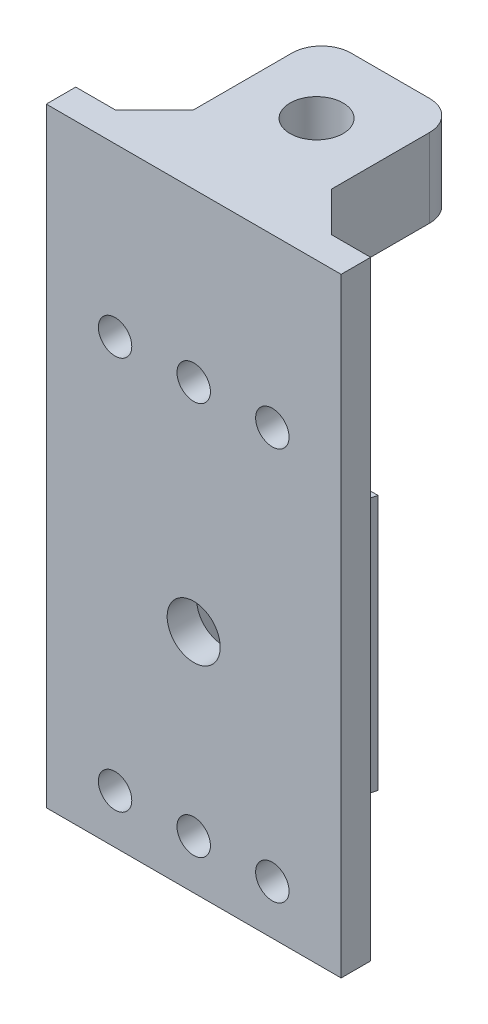
ISO-10303-21;
HEADER;
FILE_DESCRIPTION(('STEP AP214'),'2;1');
FILE_NAME('part.step','',(''),(''),'','','');
FILE_SCHEMA(('AUTOMOTIVE_DESIGN { 1 0 10303 214 1 1 1 1 }'));
ENDSEC;
DATA;
#1=APPLICATION_CONTEXT('core data for automotive mechanical design processes');
#2=APPLICATION_PROTOCOL_DEFINITION('international standard','automotive_design',2000,#1);
#3=PRODUCT_CONTEXT('',#1,'mechanical');
#4=PRODUCT('Part','Part','',(#3));
#5=PRODUCT_RELATED_PRODUCT_CATEGORY('part','',(#4));
#6=PRODUCT_DEFINITION_FORMATION('','',#4);
#7=PRODUCT_DEFINITION_CONTEXT('part definition',#1,'design');
#8=PRODUCT_DEFINITION('design','',#6,#7);
#9=PRODUCT_DEFINITION_SHAPE('','',#8);
#10=(LENGTH_UNIT() NAMED_UNIT(*) SI_UNIT(.MILLI.,.METRE.));
#11=(NAMED_UNIT(*) PLANE_ANGLE_UNIT() SI_UNIT($,.RADIAN.));
#12=(NAMED_UNIT(*) SI_UNIT($,.STERADIAN.) SOLID_ANGLE_UNIT());
#13=UNCERTAINTY_MEASURE_WITH_UNIT(LENGTH_MEASURE(1.E-05),#10,'distance_accuracy_value','');
#14=(GEOMETRIC_REPRESENTATION_CONTEXT(3) GLOBAL_UNCERTAINTY_ASSIGNED_CONTEXT((#13)) GLOBAL_UNIT_ASSIGNED_CONTEXT((#10,
#11,#12)) REPRESENTATION_CONTEXT('',''));
#15=CARTESIAN_POINT('',(0.,0.,0.));
#16=DIRECTION('',(0.,0.,1.));
#17=DIRECTION('',(1.,0.,0.));
#18=AXIS2_PLACEMENT_3D('',#15,#16,#17);
#19=CARTESIAN_POINT('',(0.,0.,0.));
#20=DIRECTION('',(0.,0.,1.));
#21=DIRECTION('',(1.,0.,0.));
#22=AXIS2_PLACEMENT_3D('',#19,#20,#21);
#23=PLANE('',#22);
#24=DIRECTION('',(0.,1.,0.));
#25=VECTOR('',#24,1.);
#26=CARTESIAN_POINT('',(4.55,-11.,0.));
#27=LINE('',#26,#25);
#28=CARTESIAN_POINT('',(4.55000000000003,-11.,0.));
#29=VERTEX_POINT('',#28);
#30=CARTESIAN_POINT('',(4.55000000000003,15.,0.));
#31=VERTEX_POINT('',#30);
#32=EDGE_CURVE('E261',#29,#31,#27,.T.);
#33=ORIENTED_EDGE('',*,*,#32,.F.);
#34=DIRECTION('',(-1.,0.,0.));
#35=VECTOR('',#34,1.);
#36=CARTESIAN_POINT('',(11.45,-11.,0.));
#37=LINE('',#36,#35);
#38=CARTESIAN_POINT('',(11.45,-11.,0.));
#39=VERTEX_POINT('',#38);
#40=EDGE_CURVE('E271',#39,#29,#37,.T.);
#41=ORIENTED_EDGE('',*,*,#40,.F.);
#42=DIRECTION('',(0.,-1.,0.));
#43=VECTOR('',#42,1.);
#44=CARTESIAN_POINT('',(11.45,-11.,0.));
#45=LINE('',#44,#43);
#46=CARTESIAN_POINT('',(11.45,15.,0.));
#47=VERTEX_POINT('',#46);
#48=EDGE_CURVE('E278',#47,#39,#45,.T.);
#49=ORIENTED_EDGE('',*,*,#48,.F.);
#50=DIRECTION('',(1.,0.,0.));
#51=VECTOR('',#50,1.);
#52=CARTESIAN_POINT('',(11.45,15.,0.));
#53=LINE('',#52,#51);
#54=EDGE_CURVE('E275',#31,#47,#53,.T.);
#55=ORIENTED_EDGE('',*,*,#54,.F.);
#56=EDGE_LOOP('',(#33,#41,#49,#55));
#57=FACE_BOUND('',#56,.T.);
#58=CARTESIAN_POINT('',(8.,-18.,0.));
#59=DIRECTION('',(0.,0.,1.));
#60=DIRECTION('',(1.,0.,0.));
#61=AXIS2_PLACEMENT_3D('',#58,#59,#60);
#62=CIRCLE('',#61,1.7);
#63=CARTESIAN_POINT('',(9.7,-18.,0.));
#64=VERTEX_POINT('',#63);
#65=EDGE_CURVE('E354',#64,#64,#62,.F.);
#66=ORIENTED_EDGE('',*,*,#65,.F.);
#67=EDGE_LOOP('',(#66));
#68=FACE_BOUND('',#67,.T.);
#69=CARTESIAN_POINT('',(-8.,22.,0.));
#70=DIRECTION('',(0.,0.,1.));
#71=DIRECTION('',(1.,0.,0.));
#72=AXIS2_PLACEMENT_3D('',#69,#70,#71);
#73=CIRCLE('',#72,1.7);
#74=CARTESIAN_POINT('',(-6.3,22.,0.));
#75=VERTEX_POINT('',#74);
#76=EDGE_CURVE('E493',#75,#75,#73,.F.);
#77=ORIENTED_EDGE('',*,*,#76,.F.);
#78=EDGE_LOOP('',(#77));
#79=FACE_BOUND('',#78,.T.);
#80=CARTESIAN_POINT('',(8.,22.,0.));
#81=DIRECTION('',(0.,0.,1.));
#82=DIRECTION('',(1.,0.,0.));
#83=AXIS2_PLACEMENT_3D('',#80,#81,#82);
#84=CIRCLE('',#83,1.7);
#85=CARTESIAN_POINT('',(9.7,22.,0.));
#86=VERTEX_POINT('',#85);
#87=EDGE_CURVE('E495',#86,#86,#84,.T.);
#88=ORIENTED_EDGE('',*,*,#87,.T.);
#89=EDGE_LOOP('',(#88));
#90=FACE_BOUND('',#89,.T.);
#91=CARTESIAN_POINT('',(0.,22.,0.));
#92=DIRECTION('',(0.,0.,1.));
#93=DIRECTION('',(1.,0.,0.));
#94=AXIS2_PLACEMENT_3D('',#91,#92,#93);
#95=CIRCLE('',#94,1.7);
#96=CARTESIAN_POINT('',(1.7,22.,0.));
#97=VERTEX_POINT('',#96);
#98=EDGE_CURVE('E406',#97,#97,#95,.T.);
#99=ORIENTED_EDGE('',*,*,#98,.T.);
#100=EDGE_LOOP('',(#99));
#101=FACE_BOUND('',#100,.T.);
#102=CARTESIAN_POINT('',(0.,0.,0.));
#103=DIRECTION('',(0.,0.,1.));
#104=DIRECTION('',(1.,0.,0.));
#105=AXIS2_PLACEMENT_3D('',#102,#103,#104);
#106=CIRCLE('',#105,2.7);
#107=CARTESIAN_POINT('',(2.7,0.,0.));
#108=VERTEX_POINT('',#107);
#109=EDGE_CURVE('E391',#108,#108,#106,.T.);
#110=ORIENTED_EDGE('',*,*,#109,.T.);
#111=EDGE_LOOP('',(#110));
#112=FACE_BOUND('',#111,.T.);
#113=CARTESIAN_POINT('',(-8.,-18.,0.));
#114=DIRECTION('',(0.,0.,1.));
#115=DIRECTION('',(1.,0.,0.));
#116=AXIS2_PLACEMENT_3D('',#113,#114,#115);
#117=CIRCLE('',#116,1.7);
#118=CARTESIAN_POINT('',(-6.3,-18.,0.));
#119=VERTEX_POINT('',#118);
#120=EDGE_CURVE('E387',#119,#119,#117,.T.);
#121=ORIENTED_EDGE('',*,*,#120,.T.);
#122=EDGE_LOOP('',(#121));
#123=FACE_BOUND('',#122,.T.);
#124=CARTESIAN_POINT('',(0.,-18.,0.));
#125=DIRECTION('',(0.,0.,1.));
#126=DIRECTION('',(1.,0.,0.));
#127=AXIS2_PLACEMENT_3D('',#124,#125,#126);
#128=CIRCLE('',#127,1.7);
#129=CARTESIAN_POINT('',(1.7,-18.,0.));
#130=VERTEX_POINT('',#129);
#131=EDGE_CURVE('E384',#130,#130,#128,.F.);
#132=ORIENTED_EDGE('',*,*,#131,.F.);
#133=EDGE_LOOP('',(#132));
#134=FACE_BOUND('',#133,.T.);
#135=DIRECTION('',(-1.,0.,0.));
#136=VECTOR('',#135,1.);
#137=CARTESIAN_POINT('',(6.99999999999999,31.,0.));
#138=LINE('',#137,#136);
#139=CARTESIAN_POINT('',(11.,31.,0.));
#140=VERTEX_POINT('',#139);
#141=CARTESIAN_POINT('',(-11.,31.,0.));
#142=VERTEX_POINT('',#141);
#143=EDGE_CURVE('E326',#140,#142,#138,.T.);
#144=ORIENTED_EDGE('',*,*,#143,.F.);
#145=DIRECTION('',(0.,1.,0.));
#146=VECTOR('',#145,1.);
#147=CARTESIAN_POINT('',(11.,39.,0.));
#148=LINE('',#147,#146);
#149=CARTESIAN_POINT('',(11.,39.,0.));
#150=VERTEX_POINT('',#149);
#151=EDGE_CURVE('E448',#140,#150,#148,.T.);
#152=ORIENTED_EDGE('',*,*,#151,.T.);
#153=DIRECTION('',(1.,0.,0.));
#154=VECTOR('',#153,1.);
#155=CARTESIAN_POINT('',(0.,39.,0.));
#156=LINE('',#155,#154);
#157=CARTESIAN_POINT('',(15.,39.,0.));
#158=VERTEX_POINT('',#157);
#159=EDGE_CURVE('E403',#150,#158,#156,.T.);
#160=ORIENTED_EDGE('',*,*,#159,.T.);
#161=DIRECTION('',(0.,1.,0.));
#162=VECTOR('',#161,1.);
#163=CARTESIAN_POINT('',(15.,0.,0.));
#164=LINE('',#163,#162);
#165=CARTESIAN_POINT('',(15.,-23.,0.));
#166=VERTEX_POINT('',#165);
#167=EDGE_CURVE('E400',#166,#158,#164,.T.);
#168=ORIENTED_EDGE('',*,*,#167,.F.);
#169=DIRECTION('',(1.,0.,0.));
#170=VECTOR('',#169,1.);
#171=CARTESIAN_POINT('',(0.,-23.,0.));
#172=LINE('',#171,#170);
#173=CARTESIAN_POINT('',(-15.,-23.,0.));
#174=VERTEX_POINT('',#173);
#175=EDGE_CURVE('E397',#174,#166,#172,.T.);
#176=ORIENTED_EDGE('',*,*,#175,.F.);
#177=DIRECTION('',(0.,1.,0.));
#178=VECTOR('',#177,1.);
#179=CARTESIAN_POINT('',(-15.,0.,0.));
#180=LINE('',#179,#178);
#181=CARTESIAN_POINT('',(-15.,39.,0.));
#182=VERTEX_POINT('',#181);
#183=EDGE_CURVE('E394',#174,#182,#180,.T.);
#184=ORIENTED_EDGE('',*,*,#183,.T.);
#185=CARTESIAN_POINT('',(-11.,39.,0.));
#186=VERTEX_POINT('',#185);
#187=EDGE_CURVE('E413',#182,#186,#156,.T.);
#188=ORIENTED_EDGE('',*,*,#187,.T.);
#189=DIRECTION('',(0.,-1.,0.));
#190=VECTOR('',#189,1.);
#191=CARTESIAN_POINT('',(-11.,31.,0.));
#192=LINE('',#191,#190);
#193=EDGE_CURVE('E443',#186,#142,#192,.T.);
#194=ORIENTED_EDGE('',*,*,#193,.T.);
#195=EDGE_LOOP('',(#144,#152,#160,#168,#176,#184,#188,#194));
#196=FACE_BOUND('',#195,.T.);
#197=DIRECTION('',(0.,1.,0.));
#198=VECTOR('',#197,1.);
#199=CARTESIAN_POINT('',(-11.45,-11.,0.));
#200=LINE('',#199,#198);
#201=CARTESIAN_POINT('',(-11.45,-11.,0.));
#202=VERTEX_POINT('',#201);
#203=CARTESIAN_POINT('',(-11.45,15.,0.));
#204=VERTEX_POINT('',#203);
#205=EDGE_CURVE('E254',#202,#204,#200,.T.);
#206=ORIENTED_EDGE('',*,*,#205,.F.);
#207=DIRECTION('',(-1.,0.,0.));
#208=VECTOR('',#207,1.);
#209=CARTESIAN_POINT('',(-11.45,-11.,0.));
#210=LINE('',#209,#208);
#211=CARTESIAN_POINT('',(-4.55000000000003,-11.,0.));
#212=VERTEX_POINT('',#211);
#213=EDGE_CURVE('E219',#212,#202,#210,.T.);
#214=ORIENTED_EDGE('',*,*,#213,.F.);
#215=DIRECTION('',(0.,-1.,0.));
#216=VECTOR('',#215,1.);
#217=CARTESIAN_POINT('',(-4.55,-11.,0.));
#218=LINE('',#217,#216);
#219=CARTESIAN_POINT('',(-4.55000000000003,15.,0.));
#220=VERTEX_POINT('',#219);
#221=EDGE_CURVE('E264',#220,#212,#218,.T.);
#222=ORIENTED_EDGE('',*,*,#221,.F.);
#223=DIRECTION('',(1.,0.,0.));
#224=VECTOR('',#223,1.);
#225=CARTESIAN_POINT('',(-11.45,15.,0.));
#226=LINE('',#225,#224);
#227=EDGE_CURVE('E232',#204,#220,#226,.T.);
#228=ORIENTED_EDGE('',*,*,#227,.F.);
#229=EDGE_LOOP('',(#206,#214,#222,#228));
#230=FACE_BOUND('',#229,.T.);
#231=ADVANCED_FACE('F36',(#57,#68,#79,#90,#101,#112,#123,#134,#196,#230),#23,.F.);
#232=CARTESIAN_POINT('',(-15.,0.,3.));
#233=DIRECTION('',(-1.,0.,0.));
#234=DIRECTION('',(0.,0.,1.));
#235=AXIS2_PLACEMENT_3D('',#232,#233,#234);
#236=PLANE('',#235);
#237=ORIENTED_EDGE('',*,*,#183,.F.);
#238=DIRECTION('',(0.,0.,-1.));
#239=VECTOR('',#238,1.);
#240=CARTESIAN_POINT('',(-15.,-23.,3.));
#241=LINE('',#240,#239);
#242=CARTESIAN_POINT('',(-15.,-23.,3.));
#243=VERTEX_POINT('',#242);
#244=EDGE_CURVE('E417',#243,#174,#241,.T.);
#245=ORIENTED_EDGE('',*,*,#244,.F.);
#246=DIRECTION('',(0.,1.,0.));
#247=VECTOR('',#246,1.);
#248=CARTESIAN_POINT('',(-15.,0.,3.));
#249=LINE('',#248,#247);
#250=CARTESIAN_POINT('',(-15.,39.,3.));
#251=VERTEX_POINT('',#250);
#252=EDGE_CURVE('E360',#243,#251,#249,.T.);
#253=ORIENTED_EDGE('',*,*,#252,.T.);
#254=DIRECTION('',(0.,0.,-1.));
#255=VECTOR('',#254,1.);
#256=CARTESIAN_POINT('',(-15.,39.,3.));
#257=LINE('',#256,#255);
#258=EDGE_CURVE('E383',#251,#182,#257,.T.);
#259=ORIENTED_EDGE('',*,*,#258,.T.);
#260=EDGE_LOOP('',(#237,#245,#253,#259));
#261=FACE_BOUND('',#260,.T.);
#262=ADVANCED_FACE('F520',(#261),#236,.T.);
#263=CARTESIAN_POINT('',(0.,-23.,3.));
#264=DIRECTION('',(0.,1.,0.));
#265=DIRECTION('',(0.,0.,1.));
#266=AXIS2_PLACEMENT_3D('',#263,#264,#265);
#267=PLANE('',#266);
#268=ORIENTED_EDGE('',*,*,#175,.T.);
#269=DIRECTION('',(0.,0.,-1.));
#270=VECTOR('',#269,1.);
#271=CARTESIAN_POINT('',(15.,-23.,3.));
#272=LINE('',#271,#270);
#273=CARTESIAN_POINT('',(15.,-23.,3.));
#274=VERTEX_POINT('',#273);
#275=EDGE_CURVE('E480',#274,#166,#272,.T.);
#276=ORIENTED_EDGE('',*,*,#275,.F.);
#277=DIRECTION('',(1.,0.,0.));
#278=VECTOR('',#277,1.);
#279=CARTESIAN_POINT('',(0.,-23.,3.));
#280=LINE('',#279,#278);
#281=EDGE_CURVE('E363',#243,#274,#280,.T.);
#282=ORIENTED_EDGE('',*,*,#281,.F.);
#283=ORIENTED_EDGE('',*,*,#244,.T.);
#284=EDGE_LOOP('',(#268,#276,#282,#283));
#285=FACE_BOUND('',#284,.T.);
#286=ADVANCED_FACE('F526',(#285),#267,.F.);
#287=CARTESIAN_POINT('',(15.,0.,3.));
#288=DIRECTION('',(-1.,0.,0.));
#289=DIRECTION('',(0.,-1.,0.));
#290=AXIS2_PLACEMENT_3D('',#287,#288,#289);
#291=PLANE('',#290);
#292=ORIENTED_EDGE('',*,*,#167,.T.);
#293=DIRECTION('',(0.,0.,-1.));
#294=VECTOR('',#293,1.);
#295=CARTESIAN_POINT('',(15.,39.,3.));
#296=LINE('',#295,#294);
#297=CARTESIAN_POINT('',(15.,39.,3.));
#298=VERTEX_POINT('',#297);
#299=EDGE_CURVE('E484',#298,#158,#296,.T.);
#300=ORIENTED_EDGE('',*,*,#299,.F.);
#301=DIRECTION('',(0.,1.,0.));
#302=VECTOR('',#301,1.);
#303=CARTESIAN_POINT('',(15.,0.,3.));
#304=LINE('',#303,#302);
#305=EDGE_CURVE('E366',#274,#298,#304,.T.);
#306=ORIENTED_EDGE('',*,*,#305,.F.);
#307=ORIENTED_EDGE('',*,*,#275,.T.);
#308=EDGE_LOOP('',(#292,#300,#306,#307));
#309=FACE_BOUND('',#308,.T.);
#310=ADVANCED_FACE('F541',(#309),#291,.F.);
#311=CARTESIAN_POINT('',(-8.,22.,3.));
#312=DIRECTION('',(0.,0.,-1.));
#313=DIRECTION('',(-1.,0.,0.));
#314=AXIS2_PLACEMENT_3D('',#311,#312,#313);
#315=CYLINDRICAL_SURFACE('',#314,1.7);
#316=CARTESIAN_POINT('',(-8.,22.,3.));
#317=DIRECTION('',(0.,0.,1.));
#318=DIRECTION('',(1.,0.,0.));
#319=AXIS2_PLACEMENT_3D('',#316,#317,#318);
#320=CIRCLE('',#319,1.7);
#321=CARTESIAN_POINT('',(-6.3,22.,3.));
#322=VERTEX_POINT('',#321);
#323=EDGE_CURVE('E377',#322,#322,#320,.F.);
#324=ORIENTED_EDGE('',*,*,#323,.F.);
#325=EDGE_LOOP('',(#324));
#326=FACE_BOUND('',#325,.T.);
#327=ORIENTED_EDGE('',*,*,#76,.T.);
#328=EDGE_LOOP('',(#327));
#329=FACE_BOUND('',#328,.T.);
#330=ADVANCED_FACE('F516',(#326,#329),#315,.F.);
#331=CARTESIAN_POINT('',(8.,22.,3.));
#332=DIRECTION('',(0.,0.,-1.));
#333=DIRECTION('',(-1.,0.,0.));
#334=AXIS2_PLACEMENT_3D('',#331,#332,#333);
#335=CYLINDRICAL_SURFACE('',#334,1.7);
#336=CARTESIAN_POINT('',(8.,22.,3.));
#337=DIRECTION('',(0.,0.,1.));
#338=DIRECTION('',(1.,0.,0.));
#339=AXIS2_PLACEMENT_3D('',#336,#337,#338);
#340=CIRCLE('',#339,1.7);
#341=CARTESIAN_POINT('',(9.7,22.,3.));
#342=VERTEX_POINT('',#341);
#343=EDGE_CURVE('E374',#342,#342,#340,.T.);
#344=ORIENTED_EDGE('',*,*,#343,.T.);
#345=EDGE_LOOP('',(#344));
#346=FACE_BOUND('',#345,.T.);
#347=ORIENTED_EDGE('',*,*,#87,.F.);
#348=EDGE_LOOP('',(#347));
#349=FACE_BOUND('',#348,.T.);
#350=ADVANCED_FACE('F506',(#346,#349),#335,.F.);
#351=CARTESIAN_POINT('',(0.,22.,3.));
#352=DIRECTION('',(0.,0.,-1.));
#353=DIRECTION('',(-1.,0.,0.));
#354=AXIS2_PLACEMENT_3D('',#351,#352,#353);
#355=CYLINDRICAL_SURFACE('',#354,1.7);
#356=CARTESIAN_POINT('',(0.,22.,3.));
#357=DIRECTION('',(0.,0.,1.));
#358=DIRECTION('',(1.,0.,0.));
#359=AXIS2_PLACEMENT_3D('',#356,#357,#358);
#360=CIRCLE('',#359,1.7);
#361=CARTESIAN_POINT('',(1.7,22.,3.));
#362=VERTEX_POINT('',#361);
#363=EDGE_CURVE('E371',#362,#362,#360,.T.);
#364=ORIENTED_EDGE('',*,*,#363,.T.);
#365=EDGE_LOOP('',(#364));
#366=FACE_BOUND('',#365,.T.);
#367=ORIENTED_EDGE('',*,*,#98,.F.);
#368=EDGE_LOOP('',(#367));
#369=FACE_BOUND('',#368,.T.);
#370=ADVANCED_FACE('F504',(#366,#369),#355,.F.);
#371=CARTESIAN_POINT('',(0.,39.,3.));
#372=DIRECTION('',(0.,1.,0.));
#373=DIRECTION('',(0.,0.,1.));
#374=AXIS2_PLACEMENT_3D('',#371,#372,#373);
#375=PLANE('',#374);
#376=CARTESIAN_POINT('',(0.,39.,-9.5));
#377=DIRECTION('',(0.,1.,0.));
#378=DIRECTION('',(0.,0.,1.));
#379=AXIS2_PLACEMENT_3D('',#376,#377,#378);
#380=CIRCLE('',#379,2.7);
#381=CARTESIAN_POINT('',(0.,39.,-6.8));
#382=VERTEX_POINT('',#381);
#383=EDGE_CURVE('E273',#382,#382,#380,.F.);
#384=ORIENTED_EDGE('',*,*,#383,.T.);
#385=EDGE_LOOP('',(#384));
#386=FACE_BOUND('',#385,.T.);
#387=DIRECTION('',(1.,0.,0.));
#388=VECTOR('',#387,1.);
#389=CARTESIAN_POINT('',(6.99999999999999,39.,-17.));
#390=LINE('',#389,#388);
#391=CARTESIAN_POINT('',(-4.00000000000001,39.,-17.));
#392=VERTEX_POINT('',#391);
#393=CARTESIAN_POINT('',(3.99999999999999,39.,-17.));
#394=VERTEX_POINT('',#393);
#395=EDGE_CURVE('E337',#392,#394,#390,.T.);
#396=ORIENTED_EDGE('',*,*,#395,.F.);
#397=CARTESIAN_POINT('',(-4.00000000000001,39.,-14.));
#398=DIRECTION('',(0.,1.,0.));
#399=DIRECTION('',(0.,0.,1.));
#400=AXIS2_PLACEMENT_3D('',#397,#398,#399);
#401=CIRCLE('',#400,3.);
#402=CARTESIAN_POINT('',(-7.00000000000001,39.,-14.));
#403=VERTEX_POINT('',#402);
#404=EDGE_CURVE('E432',#392,#403,#401,.T.);
#405=ORIENTED_EDGE('',*,*,#404,.T.);
#406=DIRECTION('',(0.,0.,1.));
#407=VECTOR('',#406,1.);
#408=CARTESIAN_POINT('',(-7.00000000000001,39.,-17.));
#409=LINE('',#408,#407);
#410=CARTESIAN_POINT('',(-7.00000000000001,39.,-4.00000000000003));
#411=VERTEX_POINT('',#410);
#412=EDGE_CURVE('E388',#403,#411,#409,.T.);
#413=ORIENTED_EDGE('',*,*,#412,.T.);
#414=DIRECTION('',(0.707106781186543,0.,-0.707106781186552));
#415=VECTOR('',#414,1.);
#416=CARTESIAN_POINT('',(-7.00000000000001,39.,-4.00000000000003));
#417=LINE('',#416,#415);
#418=EDGE_CURVE('E44',#411,#186,#417,.F.);
#419=ORIENTED_EDGE('',*,*,#418,.T.);
#420=ORIENTED_EDGE('',*,*,#187,.F.);
#421=ORIENTED_EDGE('',*,*,#258,.F.);
#422=DIRECTION('',(1.,0.,0.));
#423=VECTOR('',#422,1.);
#424=CARTESIAN_POINT('',(0.,39.,3.));
#425=LINE('',#424,#423);
#426=EDGE_CURVE('E368',#251,#298,#425,.T.);
#427=ORIENTED_EDGE('',*,*,#426,.T.);
#428=ORIENTED_EDGE('',*,*,#299,.T.);
#429=ORIENTED_EDGE('',*,*,#159,.F.);
#430=DIRECTION('',(0.707106781186543,0.,0.707106781186552));
#431=VECTOR('',#430,1.);
#432=CARTESIAN_POINT('',(6.99999999999999,39.,-4.00000000000003));
#433=LINE('',#432,#431);
#434=CARTESIAN_POINT('',(6.99999999999999,39.,-4.00000000000003));
#435=VERTEX_POINT('',#434);
#436=EDGE_CURVE('E457',#150,#435,#433,.F.);
#437=ORIENTED_EDGE('',*,*,#436,.T.);
#438=DIRECTION('',(0.,0.,1.));
#439=VECTOR('',#438,1.);
#440=CARTESIAN_POINT('',(6.99999999999999,39.,-17.));
#441=LINE('',#440,#439);
#442=CARTESIAN_POINT('',(6.99999999999999,39.,-14.));
#443=VERTEX_POINT('',#442);
#444=EDGE_CURVE('E349',#443,#435,#441,.T.);
#445=ORIENTED_EDGE('',*,*,#444,.F.);
#446=CARTESIAN_POINT('',(3.99999999999999,39.,-14.));
#447=DIRECTION('',(0.,1.,0.));
#448=DIRECTION('',(0.,0.,1.));
#449=AXIS2_PLACEMENT_3D('',#446,#447,#448);
#450=CIRCLE('',#449,3.);
#451=EDGE_CURVE('E430',#443,#394,#450,.T.);
#452=ORIENTED_EDGE('',*,*,#451,.T.);
#453=EDGE_LOOP('',(#396,#405,#413,#419,#420,#421,#427,#428,#429,#437,#445,#452));
#454=FACE_BOUND('',#453,.T.);
#455=ADVANCED_FACE('F461',(#386,#454),#375,.T.);
#456=CARTESIAN_POINT('',(0.,0.,3.));
#457=DIRECTION('',(0.,0.,-1.));
#458=DIRECTION('',(-1.,0.,0.));
#459=AXIS2_PLACEMENT_3D('',#456,#457,#458);
#460=CYLINDRICAL_SURFACE('',#459,2.7);
#461=CARTESIAN_POINT('',(0.,0.,3.));
#462=DIRECTION('',(0.,0.,1.));
#463=DIRECTION('',(1.,0.,0.));
#464=AXIS2_PLACEMENT_3D('',#461,#462,#463);
#465=CIRCLE('',#464,2.7);
#466=CARTESIAN_POINT('',(2.7,0.,3.));
#467=VERTEX_POINT('',#466);
#468=EDGE_CURVE('E357',#467,#467,#465,.T.);
#469=ORIENTED_EDGE('',*,*,#468,.T.);
#470=EDGE_LOOP('',(#469));
#471=FACE_BOUND('',#470,.T.);
#472=ORIENTED_EDGE('',*,*,#109,.F.);
#473=EDGE_LOOP('',(#472));
#474=FACE_BOUND('',#473,.T.);
#475=ADVANCED_FACE('F513',(#471,#474),#460,.F.);
#476=CARTESIAN_POINT('',(-8.,-18.,3.));
#477=DIRECTION('',(0.,0.,-1.));
#478=DIRECTION('',(-1.,0.,0.));
#479=AXIS2_PLACEMENT_3D('',#476,#477,#478);
#480=CYLINDRICAL_SURFACE('',#479,1.7);
#481=CARTESIAN_POINT('',(-8.,-18.,3.));
#482=DIRECTION('',(0.,0.,1.));
#483=DIRECTION('',(1.,0.,0.));
#484=AXIS2_PLACEMENT_3D('',#481,#482,#483);
#485=CIRCLE('',#484,1.7);
#486=CARTESIAN_POINT('',(-6.3,-18.,3.));
#487=VERTEX_POINT('',#486);
#488=EDGE_CURVE('E353',#487,#487,#485,.T.);
#489=ORIENTED_EDGE('',*,*,#488,.T.);
#490=EDGE_LOOP('',(#489));
#491=FACE_BOUND('',#490,.T.);
#492=ORIENTED_EDGE('',*,*,#120,.F.);
#493=EDGE_LOOP('',(#492));
#494=FACE_BOUND('',#493,.T.);
#495=ADVANCED_FACE('F820',(#491,#494),#480,.F.);
#496=CARTESIAN_POINT('',(0.,-18.,3.));
#497=DIRECTION('',(0.,0.,-1.));
#498=DIRECTION('',(-1.,0.,0.));
#499=AXIS2_PLACEMENT_3D('',#496,#497,#498);
#500=CYLINDRICAL_SURFACE('',#499,1.7);
#501=CARTESIAN_POINT('',(0.,-18.,3.));
#502=DIRECTION('',(0.,0.,1.));
#503=DIRECTION('',(1.,0.,0.));
#504=AXIS2_PLACEMENT_3D('',#501,#502,#503);
#505=CIRCLE('',#504,1.7);
#506=CARTESIAN_POINT('',(1.7,-18.,3.));
#507=VERTEX_POINT('',#506);
#508=EDGE_CURVE('E350',#507,#507,#505,.F.);
#509=ORIENTED_EDGE('',*,*,#508,.F.);
#510=EDGE_LOOP('',(#509));
#511=FACE_BOUND('',#510,.T.);
#512=ORIENTED_EDGE('',*,*,#131,.T.);
#513=EDGE_LOOP('',(#512));
#514=FACE_BOUND('',#513,.T.);
#515=ADVANCED_FACE('F538',(#511,#514),#500,.F.);
#516=CARTESIAN_POINT('',(8.,-18.,3.));
#517=DIRECTION('',(0.,0.,-1.));
#518=DIRECTION('',(-1.,0.,0.));
#519=AXIS2_PLACEMENT_3D('',#516,#517,#518);
#520=CYLINDRICAL_SURFACE('',#519,1.7);
#521=CARTESIAN_POINT('',(8.,-18.,3.));
#522=DIRECTION('',(0.,0.,1.));
#523=DIRECTION('',(1.,0.,0.));
#524=AXIS2_PLACEMENT_3D('',#521,#522,#523);
#525=CIRCLE('',#524,1.7);
#526=CARTESIAN_POINT('',(9.7,-18.,3.));
#527=VERTEX_POINT('',#526);
#528=EDGE_CURVE('E380',#527,#527,#525,.F.);
#529=ORIENTED_EDGE('',*,*,#528,.F.);
#530=EDGE_LOOP('',(#529));
#531=FACE_BOUND('',#530,.T.);
#532=ORIENTED_EDGE('',*,*,#65,.T.);
#533=EDGE_LOOP('',(#532));
#534=FACE_BOUND('',#533,.T.);
#535=ADVANCED_FACE('F535',(#531,#534),#520,.F.);
#536=CARTESIAN_POINT('',(0.,0.,3.));
#537=DIRECTION('',(0.,0.,1.));
#538=DIRECTION('',(1.,0.,0.));
#539=AXIS2_PLACEMENT_3D('',#536,#537,#538);
#540=PLANE('',#539);
#541=ORIENTED_EDGE('',*,*,#508,.T.);
#542=EDGE_LOOP('',(#541));
#543=FACE_BOUND('',#542,.T.);
#544=ORIENTED_EDGE('',*,*,#488,.F.);
#545=EDGE_LOOP('',(#544));
#546=FACE_BOUND('',#545,.T.);
#547=ORIENTED_EDGE('',*,*,#468,.F.);
#548=EDGE_LOOP('',(#547));
#549=FACE_BOUND('',#548,.T.);
#550=ORIENTED_EDGE('',*,*,#252,.F.);
#551=ORIENTED_EDGE('',*,*,#281,.T.);
#552=ORIENTED_EDGE('',*,*,#305,.T.);
#553=ORIENTED_EDGE('',*,*,#426,.F.);
#554=EDGE_LOOP('',(#550,#551,#552,#553));
#555=FACE_BOUND('',#554,.T.);
#556=ORIENTED_EDGE('',*,*,#363,.F.);
#557=EDGE_LOOP('',(#556));
#558=FACE_BOUND('',#557,.T.);
#559=ORIENTED_EDGE('',*,*,#343,.F.);
#560=EDGE_LOOP('',(#559));
#561=FACE_BOUND('',#560,.T.);
#562=ORIENTED_EDGE('',*,*,#323,.T.);
#563=EDGE_LOOP('',(#562));
#564=FACE_BOUND('',#563,.T.);
#565=ORIENTED_EDGE('',*,*,#528,.T.);
#566=EDGE_LOOP('',(#565));
#567=FACE_BOUND('',#566,.T.);
#568=ADVANCED_FACE('F533',(#543,#546,#549,#555,#558,#561,#564,#567),#540,.T.);
#569=CARTESIAN_POINT('',(-7.00000000000001,31.,-17.));
#570=DIRECTION('',(1.,0.,0.));
#571=DIRECTION('',(0.,0.,-1.));
#572=AXIS2_PLACEMENT_3D('',#569,#570,#571);
#573=PLANE('',#572);
#574=DIRECTION('',(0.,0.,1.));
#575=VECTOR('',#574,1.);
#576=CARTESIAN_POINT('',(-7.00000000000001,31.,-17.));
#577=LINE('',#576,#575);
#578=CARTESIAN_POINT('',(-7.00000000000001,31.,-14.));
#579=VERTEX_POINT('',#578);
#580=CARTESIAN_POINT('',(-7.00000000000001,31.,-4.00000000000003));
#581=VERTEX_POINT('',#580);
#582=EDGE_CURVE('E343',#579,#581,#577,.T.);
#583=ORIENTED_EDGE('',*,*,#582,.T.);
#584=DIRECTION('',(0.,1.,0.));
#585=VECTOR('',#584,1.);
#586=CARTESIAN_POINT('',(-7.00000000000001,39.,-4.00000000000003));
#587=LINE('',#586,#585);
#588=EDGE_CURVE('E450',#581,#411,#587,.T.);
#589=ORIENTED_EDGE('',*,*,#588,.T.);
#590=ORIENTED_EDGE('',*,*,#412,.F.);
#591=DIRECTION('',(0.,1.,0.));
#592=VECTOR('',#591,1.);
#593=CARTESIAN_POINT('',(-7.00000000000001,31.,-14.));
#594=LINE('',#593,#592);
#595=EDGE_CURVE('E434',#403,#579,#594,.F.);
#596=ORIENTED_EDGE('',*,*,#595,.T.);
#597=EDGE_LOOP('',(#583,#589,#590,#596));
#598=FACE_BOUND('',#597,.T.);
#599=ADVANCED_FACE('F467',(#598),#573,.F.);
#600=CARTESIAN_POINT('',(6.99999999999999,31.,-17.));
#601=DIRECTION('',(-1.,0.,0.));
#602=DIRECTION('',(0.,0.,1.));
#603=AXIS2_PLACEMENT_3D('',#600,#601,#602);
#604=PLANE('',#603);
#605=ORIENTED_EDGE('',*,*,#444,.T.);
#606=DIRECTION('',(0.,-1.,0.));
#607=VECTOR('',#606,1.);
#608=CARTESIAN_POINT('',(6.99999999999999,31.,-4.00000000000003));
#609=LINE('',#608,#607);
#610=CARTESIAN_POINT('',(6.99999999999999,31.,-4.00000000000003));
#611=VERTEX_POINT('',#610);
#612=EDGE_CURVE('E441',#435,#611,#609,.T.);
#613=ORIENTED_EDGE('',*,*,#612,.T.);
#614=DIRECTION('',(0.,0.,1.));
#615=VECTOR('',#614,1.);
#616=CARTESIAN_POINT('',(6.99999999999999,31.,-17.));
#617=LINE('',#616,#615);
#618=CARTESIAN_POINT('',(6.99999999999999,31.,-14.));
#619=VERTEX_POINT('',#618);
#620=EDGE_CURVE('E346',#619,#611,#617,.T.);
#621=ORIENTED_EDGE('',*,*,#620,.F.);
#622=DIRECTION('',(0.,-1.,0.));
#623=VECTOR('',#622,1.);
#624=CARTESIAN_POINT('',(6.99999999999999,31.,-14.));
#625=LINE('',#624,#623);
#626=EDGE_CURVE('E440',#619,#443,#625,.F.);
#627=ORIENTED_EDGE('',*,*,#626,.T.);
#628=EDGE_LOOP('',(#605,#613,#621,#627));
#629=FACE_BOUND('',#628,.T.);
#630=ADVANCED_FACE('F561',(#629),#604,.F.);
#631=CARTESIAN_POINT('',(6.99999999999999,31.,-17.));
#632=DIRECTION('',(0.,1.,0.));
#633=DIRECTION('',(0.,0.,1.));
#634=AXIS2_PLACEMENT_3D('',#631,#632,#633);
#635=PLANE('',#634);
#636=DIRECTION('',(0.,0.,1.));
#637=VECTOR('',#636,1.);
#638=CARTESIAN_POINT('',(4.,31.,-11.8094010767585));
#639=LINE('',#638,#637);
#640=CARTESIAN_POINT('',(4.,31.,-11.8094010767585));
#641=VERTEX_POINT('',#640);
#642=CARTESIAN_POINT('',(4.,31.,-7.1905989232415));
#643=VERTEX_POINT('',#642);
#644=EDGE_CURVE('E310',#641,#643,#639,.T.);
#645=ORIENTED_EDGE('',*,*,#644,.F.);
#646=DIRECTION('',(0.866025403784438,0.,0.5));
#647=VECTOR('',#646,1.);
#648=CARTESIAN_POINT('',(0.,31.,-14.118802153517));
#649=LINE('',#648,#647);
#650=CARTESIAN_POINT('',(0.,31.,-14.118802153517));
#651=VERTEX_POINT('',#650);
#652=EDGE_CURVE('E286',#651,#641,#649,.T.);
#653=ORIENTED_EDGE('',*,*,#652,.F.);
#654=DIRECTION('',(0.866025403784438,0.,-0.5));
#655=VECTOR('',#654,1.);
#656=CARTESIAN_POINT('',(-4.,31.,-11.8094010767585));
#657=LINE('',#656,#655);
#658=CARTESIAN_POINT('',(-4.,31.,-11.8094010767585));
#659=VERTEX_POINT('',#658);
#660=EDGE_CURVE('E293',#659,#651,#657,.T.);
#661=ORIENTED_EDGE('',*,*,#660,.F.);
#662=DIRECTION('',(0.,0.,-1.));
#663=VECTOR('',#662,1.);
#664=CARTESIAN_POINT('',(-4.,31.,-7.1905989232415));
#665=LINE('',#664,#663);
#666=CARTESIAN_POINT('',(-4.,31.,-7.1905989232415));
#667=VERTEX_POINT('',#666);
#668=EDGE_CURVE('E319',#667,#659,#665,.T.);
#669=ORIENTED_EDGE('',*,*,#668,.F.);
#670=DIRECTION('',(-0.866025403784438,0.,-0.5));
#671=VECTOR('',#670,1.);
#672=CARTESIAN_POINT('',(0.,31.,-4.88119784648299));
#673=LINE('',#672,#671);
#674=CARTESIAN_POINT('',(0.,31.,-4.88119784648299));
#675=VERTEX_POINT('',#674);
#676=EDGE_CURVE('E316',#675,#667,#673,.T.);
#677=ORIENTED_EDGE('',*,*,#676,.F.);
#678=DIRECTION('',(-0.866025403784439,0.,0.5));
#679=VECTOR('',#678,1.);
#680=CARTESIAN_POINT('',(4.,31.,-7.1905989232415));
#681=LINE('',#680,#679);
#682=EDGE_CURVE('E313',#643,#675,#681,.T.);
#683=ORIENTED_EDGE('',*,*,#682,.F.);
#684=EDGE_LOOP('',(#645,#653,#661,#669,#677,#683));
#685=FACE_BOUND('',#684,.T.);
#686=ORIENTED_EDGE('',*,*,#582,.F.);
#687=CARTESIAN_POINT('',(-4.00000000000001,31.,-14.));
#688=DIRECTION('',(0.,1.,0.));
#689=DIRECTION('',(0.,0.,1.));
#690=AXIS2_PLACEMENT_3D('',#687,#688,#689);
#691=CIRCLE('',#690,3.);
#692=CARTESIAN_POINT('',(-4.00000000000001,31.,-17.));
#693=VERTEX_POINT('',#692);
#694=EDGE_CURVE('E438',#579,#693,#691,.F.);
#695=ORIENTED_EDGE('',*,*,#694,.T.);
#696=DIRECTION('',(-1.,0.,0.));
#697=VECTOR('',#696,1.);
#698=CARTESIAN_POINT('',(6.99999999999999,31.,-17.));
#699=LINE('',#698,#697);
#700=CARTESIAN_POINT('',(3.99999999999999,31.,-17.));
#701=VERTEX_POINT('',#700);
#702=EDGE_CURVE('E340',#701,#693,#699,.T.);
#703=ORIENTED_EDGE('',*,*,#702,.F.);
#704=CARTESIAN_POINT('',(3.99999999999999,31.,-14.));
#705=DIRECTION('',(0.,1.,0.));
#706=DIRECTION('',(0.,0.,1.));
#707=AXIS2_PLACEMENT_3D('',#704,#705,#706);
#708=CIRCLE('',#707,3.);
#709=EDGE_CURVE('E436',#701,#619,#708,.F.);
#710=ORIENTED_EDGE('',*,*,#709,.T.);
#711=ORIENTED_EDGE('',*,*,#620,.T.);
#712=DIRECTION('',(-0.707106781186543,0.,-0.707106781186552));
#713=VECTOR('',#712,1.);
#714=CARTESIAN_POINT('',(0.500000000000003,31.,-10.5000000000001));
#715=LINE('',#714,#713);
#716=EDGE_CURVE('E454',#611,#140,#715,.F.);
#717=ORIENTED_EDGE('',*,*,#716,.T.);
#718=ORIENTED_EDGE('',*,*,#143,.T.);
#719=DIRECTION('',(-0.707106781186543,0.,0.707106781186552));
#720=VECTOR('',#719,1.);
#721=CARTESIAN_POINT('',(6.49999999999989,31.,-17.5000000000001));
#722=LINE('',#721,#720);
#723=EDGE_CURVE('E11',#142,#581,#722,.F.);
#724=ORIENTED_EDGE('',*,*,#723,.T.);
#725=EDGE_LOOP('',(#686,#695,#703,#710,#711,#717,#718,#724));
#726=FACE_BOUND('',#725,.T.);
#727=ADVANCED_FACE('F470',(#685,#726),#635,.F.);
#728=CARTESIAN_POINT('',(0.,0.,-17.));
#729=DIRECTION('',(0.,0.,1.));
#730=DIRECTION('',(1.,0.,0.));
#731=AXIS2_PLACEMENT_3D('',#728,#729,#730);
#732=PLANE('',#731);
#733=ORIENTED_EDGE('',*,*,#702,.T.);
#734=DIRECTION('',(0.,1.,0.));
#735=VECTOR('',#734,1.);
#736=CARTESIAN_POINT('',(-4.00000000000001,0.,-17.));
#737=LINE('',#736,#735);
#738=EDGE_CURVE('E427',#693,#392,#737,.T.);
#739=ORIENTED_EDGE('',*,*,#738,.T.);
#740=ORIENTED_EDGE('',*,*,#395,.T.);
#741=DIRECTION('',(0.,-1.,0.));
#742=VECTOR('',#741,1.);
#743=CARTESIAN_POINT('',(3.99999999999999,0.,-17.));
#744=LINE('',#743,#742);
#745=EDGE_CURVE('E477',#394,#701,#744,.T.);
#746=ORIENTED_EDGE('',*,*,#745,.T.);
#747=EDGE_LOOP('',(#733,#739,#740,#746));
#748=FACE_BOUND('',#747,.T.);
#749=ADVANCED_FACE('F586',(#748),#732,.F.);
#750=CARTESIAN_POINT('',(0.,35.,-14.118802153517));
#751=DIRECTION('',(0.5,0.,-0.866025403784439));
#752=DIRECTION('',(-0.866025403784438,0.,-0.5));
#753=AXIS2_PLACEMENT_3D('',#750,#751,#752);
#754=PLANE('',#753);
#755=ORIENTED_EDGE('',*,*,#652,.T.);
#756=DIRECTION('',(0.,-1.,0.));
#757=VECTOR('',#756,1.);
#758=CARTESIAN_POINT('',(4.,35.,-11.8094010767585));
#759=LINE('',#758,#757);
#760=CARTESIAN_POINT('',(4.,35.,-11.8094010767585));
#761=VERTEX_POINT('',#760);
#762=EDGE_CURVE('E308',#761,#641,#759,.T.);
#763=ORIENTED_EDGE('',*,*,#762,.F.);
#764=DIRECTION('',(0.866025403784438,0.,0.5));
#765=VECTOR('',#764,1.);
#766=CARTESIAN_POINT('',(0.,35.,-14.118802153517));
#767=LINE('',#766,#765);
#768=CARTESIAN_POINT('',(0.,35.,-14.118802153517));
#769=VERTEX_POINT('',#768);
#770=EDGE_CURVE('E289',#769,#761,#767,.T.);
#771=ORIENTED_EDGE('',*,*,#770,.F.);
#772=DIRECTION('',(0.,-1.,0.));
#773=VECTOR('',#772,1.);
#774=CARTESIAN_POINT('',(0.,35.,-14.118802153517));
#775=LINE('',#774,#773);
#776=EDGE_CURVE('E324',#769,#651,#775,.T.);
#777=ORIENTED_EDGE('',*,*,#776,.T.);
#778=EDGE_LOOP('',(#755,#763,#771,#777));
#779=FACE_BOUND('',#778,.T.);
#780=ADVANCED_FACE('F588',(#779),#754,.F.);
#781=CARTESIAN_POINT('',(-4.,35.,-11.8094010767585));
#782=DIRECTION('',(-0.5,0.,-0.866025403784439));
#783=DIRECTION('',(-0.866025403784438,0.,0.5));
#784=AXIS2_PLACEMENT_3D('',#781,#782,#783);
#785=PLANE('',#784);
#786=ORIENTED_EDGE('',*,*,#660,.T.);
#787=ORIENTED_EDGE('',*,*,#776,.F.);
#788=DIRECTION('',(0.866025403784438,0.,-0.5));
#789=VECTOR('',#788,1.);
#790=CARTESIAN_POINT('',(-4.,35.,-11.8094010767585));
#791=LINE('',#790,#789);
#792=CARTESIAN_POINT('',(-4.,35.,-11.8094010767585));
#793=VERTEX_POINT('',#792);
#794=EDGE_CURVE('E305',#793,#769,#791,.T.);
#795=ORIENTED_EDGE('',*,*,#794,.F.);
#796=DIRECTION('',(0.,-1.,0.));
#797=VECTOR('',#796,1.);
#798=CARTESIAN_POINT('',(-4.,35.,-11.8094010767585));
#799=LINE('',#798,#797);
#800=EDGE_CURVE('E327',#793,#659,#799,.T.);
#801=ORIENTED_EDGE('',*,*,#800,.T.);
#802=EDGE_LOOP('',(#786,#787,#795,#801));
#803=FACE_BOUND('',#802,.T.);
#804=ADVANCED_FACE('F594',(#803),#785,.F.);
#805=CARTESIAN_POINT('',(-4.,35.,-7.1905989232415));
#806=DIRECTION('',(-1.,0.,0.));
#807=DIRECTION('',(0.,0.,1.));
#808=AXIS2_PLACEMENT_3D('',#805,#806,#807);
#809=PLANE('',#808);
#810=ORIENTED_EDGE('',*,*,#668,.T.);
#811=ORIENTED_EDGE('',*,*,#800,.F.);
#812=DIRECTION('',(0.,0.,-1.));
#813=VECTOR('',#812,1.);
#814=CARTESIAN_POINT('',(-4.,35.,-7.1905989232415));
#815=LINE('',#814,#813);
#816=CARTESIAN_POINT('',(-4.,35.,-7.1905989232415));
#817=VERTEX_POINT('',#816);
#818=EDGE_CURVE('E302',#817,#793,#815,.T.);
#819=ORIENTED_EDGE('',*,*,#818,.F.);
#820=DIRECTION('',(0.,-1.,0.));
#821=VECTOR('',#820,1.);
#822=CARTESIAN_POINT('',(-4.,35.,-7.1905989232415));
#823=LINE('',#822,#821);
#824=EDGE_CURVE('E329',#817,#667,#823,.T.);
#825=ORIENTED_EDGE('',*,*,#824,.T.);
#826=EDGE_LOOP('',(#810,#811,#819,#825));
#827=FACE_BOUND('',#826,.T.);
#828=ADVANCED_FACE('F749',(#827),#809,.F.);
#829=CARTESIAN_POINT('',(0.,35.,-4.88119784648299));
#830=DIRECTION('',(-0.5,0.,0.866025403784438));
#831=DIRECTION('',(0.866025403784438,0.,0.5));
#832=AXIS2_PLACEMENT_3D('',#829,#830,#831);
#833=PLANE('',#832);
#834=ORIENTED_EDGE('',*,*,#676,.T.);
#835=ORIENTED_EDGE('',*,*,#824,.F.);
#836=DIRECTION('',(-0.866025403784438,0.,-0.5));
#837=VECTOR('',#836,1.);
#838=CARTESIAN_POINT('',(0.,35.,-4.88119784648299));
#839=LINE('',#838,#837);
#840=CARTESIAN_POINT('',(0.,35.,-4.88119784648299));
#841=VERTEX_POINT('',#840);
#842=EDGE_CURVE('E299',#841,#817,#839,.T.);
#843=ORIENTED_EDGE('',*,*,#842,.F.);
#844=DIRECTION('',(0.,-1.,0.));
#845=VECTOR('',#844,1.);
#846=CARTESIAN_POINT('',(0.,35.,-4.88119784648299));
#847=LINE('',#846,#845);
#848=EDGE_CURVE('E331',#841,#675,#847,.T.);
#849=ORIENTED_EDGE('',*,*,#848,.T.);
#850=EDGE_LOOP('',(#834,#835,#843,#849));
#851=FACE_BOUND('',#850,.T.);
#852=ADVANCED_FACE('F753',(#851),#833,.F.);
#853=CARTESIAN_POINT('',(4.,35.,-7.1905989232415));
#854=DIRECTION('',(0.5,0.,0.866025403784439));
#855=DIRECTION('',(0.866025403784439,0.,-0.5));
#856=AXIS2_PLACEMENT_3D('',#853,#854,#855);
#857=PLANE('',#856);
#858=ORIENTED_EDGE('',*,*,#682,.T.);
#859=ORIENTED_EDGE('',*,*,#848,.F.);
#860=DIRECTION('',(-0.866025403784439,0.,0.5));
#861=VECTOR('',#860,1.);
#862=CARTESIAN_POINT('',(4.,35.,-7.1905989232415));
#863=LINE('',#862,#861);
#864=CARTESIAN_POINT('',(4.,35.,-7.1905989232415));
#865=VERTEX_POINT('',#864);
#866=EDGE_CURVE('E296',#865,#841,#863,.T.);
#867=ORIENTED_EDGE('',*,*,#866,.F.);
#868=DIRECTION('',(0.,-1.,0.));
#869=VECTOR('',#868,1.);
#870=CARTESIAN_POINT('',(4.,35.,-7.1905989232415));
#871=LINE('',#870,#869);
#872=EDGE_CURVE('E333',#865,#643,#871,.T.);
#873=ORIENTED_EDGE('',*,*,#872,.T.);
#874=EDGE_LOOP('',(#858,#859,#867,#873));
#875=FACE_BOUND('',#874,.T.);
#876=ADVANCED_FACE('F757',(#875),#857,.F.);
#877=CARTESIAN_POINT('',(4.,35.,-11.8094010767585));
#878=DIRECTION('',(1.,0.,0.));
#879=DIRECTION('',(0.,0.,-1.));
#880=AXIS2_PLACEMENT_3D('',#877,#878,#879);
#881=PLANE('',#880);
#882=ORIENTED_EDGE('',*,*,#644,.T.);
#883=ORIENTED_EDGE('',*,*,#872,.F.);
#884=DIRECTION('',(0.,0.,1.));
#885=VECTOR('',#884,1.);
#886=CARTESIAN_POINT('',(4.,35.,-11.8094010767585));
#887=LINE('',#886,#885);
#888=EDGE_CURVE('E292',#761,#865,#887,.T.);
#889=ORIENTED_EDGE('',*,*,#888,.F.);
#890=ORIENTED_EDGE('',*,*,#762,.T.);
#891=EDGE_LOOP('',(#882,#883,#889,#890));
#892=FACE_BOUND('',#891,.T.);
#893=ADVANCED_FACE('F745',(#892),#881,.F.);
#894=CARTESIAN_POINT('',(0.,35.,0.));
#895=DIRECTION('',(0.,-1.,0.));
#896=DIRECTION('',(0.,0.,-1.));
#897=AXIS2_PLACEMENT_3D('',#894,#895,#896);
#898=PLANE('',#897);
#899=CARTESIAN_POINT('',(0.,35.,-9.5));
#900=DIRECTION('',(0.,-1.,0.));
#901=DIRECTION('',(0.,0.,-1.));
#902=AXIS2_PLACEMENT_3D('',#899,#900,#901);
#903=CIRCLE('',#902,2.7);
#904=CARTESIAN_POINT('',(0.,35.,-12.2));
#905=VERTEX_POINT('',#904);
#906=EDGE_CURVE('E283',#905,#905,#903,.T.);
#907=ORIENTED_EDGE('',*,*,#906,.F.);
#908=EDGE_LOOP('',(#907));
#909=FACE_BOUND('',#908,.T.);
#910=ORIENTED_EDGE('',*,*,#770,.T.);
#911=ORIENTED_EDGE('',*,*,#888,.T.);
#912=ORIENTED_EDGE('',*,*,#866,.T.);
#913=ORIENTED_EDGE('',*,*,#842,.T.);
#914=ORIENTED_EDGE('',*,*,#818,.T.);
#915=ORIENTED_EDGE('',*,*,#794,.T.);
#916=EDGE_LOOP('',(#910,#911,#912,#913,#914,#915));
#917=FACE_BOUND('',#916,.T.);
#918=ADVANCED_FACE('F741',(#909,#917),#898,.T.);
#919=CARTESIAN_POINT('',(0.,39.00105,-9.5));
#920=DIRECTION('',(0.,-1.,0.));
#921=DIRECTION('',(0.,0.,-1.));
#922=AXIS2_PLACEMENT_3D('',#919,#920,#921);
#923=CYLINDRICAL_SURFACE('',#922,2.7);
#924=ORIENTED_EDGE('',*,*,#383,.F.);
#925=EDGE_LOOP('',(#924));
#926=FACE_BOUND('',#925,.T.);
#927=ORIENTED_EDGE('',*,*,#906,.T.);
#928=EDGE_LOOP('',(#927));
#929=FACE_BOUND('',#928,.T.);
#930=ADVANCED_FACE('F738',(#926,#929),#923,.F.);
#931=CARTESIAN_POINT('',(-4.00000000000001,0.,-14.));
#932=DIRECTION('',(0.,1.,0.));
#933=DIRECTION('',(0.,0.,1.));
#934=AXIS2_PLACEMENT_3D('',#931,#932,#933);
#935=CYLINDRICAL_SURFACE('',#934,3.);
#936=ORIENTED_EDGE('',*,*,#694,.F.);
#937=ORIENTED_EDGE('',*,*,#595,.F.);
#938=ORIENTED_EDGE('',*,*,#404,.F.);
#939=ORIENTED_EDGE('',*,*,#738,.F.);
#940=EDGE_LOOP('',(#936,#937,#938,#939));
#941=FACE_BOUND('',#940,.T.);
#942=ADVANCED_FACE('F474',(#941),#935,.T.);
#943=CARTESIAN_POINT('',(3.99999999999999,0.,-14.));
#944=DIRECTION('',(0.,-1.,0.));
#945=DIRECTION('',(0.,0.,-1.));
#946=AXIS2_PLACEMENT_3D('',#943,#944,#945);
#947=CYLINDRICAL_SURFACE('',#946,3.);
#948=ORIENTED_EDGE('',*,*,#451,.F.);
#949=ORIENTED_EDGE('',*,*,#626,.F.);
#950=ORIENTED_EDGE('',*,*,#709,.F.);
#951=ORIENTED_EDGE('',*,*,#745,.F.);
#952=EDGE_LOOP('',(#948,#949,#950,#951));
#953=FACE_BOUND('',#952,.T.);
#954=ADVANCED_FACE('F585',(#953),#947,.T.);
#955=CARTESIAN_POINT('',(6.99999999999999,31.,-4.00000000000003));
#956=DIRECTION('',(0.707106781186552,0.,-0.707106781186543));
#957=DIRECTION('',(0.,1.,0.));
#958=AXIS2_PLACEMENT_3D('',#955,#956,#957);
#959=PLANE('',#958);
#960=ORIENTED_EDGE('',*,*,#436,.F.);
#961=ORIENTED_EDGE('',*,*,#151,.F.);
#962=ORIENTED_EDGE('',*,*,#716,.F.);
#963=ORIENTED_EDGE('',*,*,#612,.F.);
#964=EDGE_LOOP('',(#960,#961,#962,#963));
#965=FACE_BOUND('',#964,.T.);
#966=ADVANCED_FACE('F581',(#965),#959,.T.);
#967=CARTESIAN_POINT('',(-7.00000000000001,31.,-4.00000000000003));
#968=DIRECTION('',(-0.707106781186552,0.,-0.707106781186543));
#969=DIRECTION('',(0.,-1.,0.));
#970=AXIS2_PLACEMENT_3D('',#967,#968,#969);
#971=PLANE('',#970);
#972=ORIENTED_EDGE('',*,*,#723,.F.);
#973=ORIENTED_EDGE('',*,*,#193,.F.);
#974=ORIENTED_EDGE('',*,*,#418,.F.);
#975=ORIENTED_EDGE('',*,*,#588,.F.);
#976=EDGE_LOOP('',(#972,#973,#974,#975));
#977=FACE_BOUND('',#976,.T.);
#978=ADVANCED_FACE('F38',(#977),#971,.T.);
#979=CARTESIAN_POINT('',(11.45,15.,-3.4));
#980=DIRECTION('',(0.,-1.,0.));
#981=DIRECTION('',(0.,0.,-1.));
#982=AXIS2_PLACEMENT_3D('',#979,#980,#981);
#983=PLANE('',#982);
#984=ORIENTED_EDGE('',*,*,#54,.T.);
#985=DIRECTION('',(0.255892560316283,0.,-0.966705227861512));
#986=VECTOR('',#985,1.);
#987=CARTESIAN_POINT('',(12.35,15.,-3.4));
#988=LINE('',#987,#986);
#989=CARTESIAN_POINT('',(12.35,15.,-3.4));
#990=VERTEX_POINT('',#989);
#991=EDGE_CURVE('E251',#47,#990,#988,.T.);
#992=ORIENTED_EDGE('',*,*,#991,.T.);
#993=DIRECTION('',(1.,0.,0.));
#994=VECTOR('',#993,1.);
#995=CARTESIAN_POINT('',(11.45,15.,-3.4));
#996=LINE('',#995,#994);
#997=CARTESIAN_POINT('',(3.65,15.,-3.4));
#998=VERTEX_POINT('',#997);
#999=EDGE_CURVE('E268',#998,#990,#996,.T.);
#1000=ORIENTED_EDGE('',*,*,#999,.F.);
#1001=DIRECTION('',(0.255892560316289,0.,0.96670522786151));
#1002=VECTOR('',#1001,1.);
#1003=CARTESIAN_POINT('',(3.65,15.,-3.4));
#1004=LINE('',#1003,#1002);
#1005=EDGE_CURVE('E242',#998,#31,#1004,.T.);
#1006=ORIENTED_EDGE('',*,*,#1005,.T.);
#1007=EDGE_LOOP('',(#984,#992,#1000,#1006));
#1008=FACE_BOUND('',#1007,.T.);
#1009=ADVANCED_FACE('F628',(#1008),#983,.F.);
#1010=CARTESIAN_POINT('',(11.45,-11.,-3.4));
#1011=DIRECTION('',(0.,1.,0.));
#1012=DIRECTION('',(0.,0.,1.));
#1013=AXIS2_PLACEMENT_3D('',#1010,#1011,#1012);
#1014=PLANE('',#1013);
#1015=ORIENTED_EDGE('',*,*,#40,.T.);
#1016=DIRECTION('',(-0.255892560316289,0.,-0.96670522786151));
#1017=VECTOR('',#1016,1.);
#1018=CARTESIAN_POINT('',(3.65,-11.,-3.4));
#1019=LINE('',#1018,#1017);
#1020=CARTESIAN_POINT('',(3.65,-11.,-3.4));
#1021=VERTEX_POINT('',#1020);
#1022=EDGE_CURVE('E248',#29,#1021,#1019,.T.);
#1023=ORIENTED_EDGE('',*,*,#1022,.T.);
#1024=DIRECTION('',(-1.,0.,0.));
#1025=VECTOR('',#1024,1.);
#1026=CARTESIAN_POINT('',(11.45,-11.,-3.4));
#1027=LINE('',#1026,#1025);
#1028=CARTESIAN_POINT('',(12.35,-11.,-3.4));
#1029=VERTEX_POINT('',#1028);
#1030=EDGE_CURVE('E270',#1029,#1021,#1027,.T.);
#1031=ORIENTED_EDGE('',*,*,#1030,.F.);
#1032=DIRECTION('',(-0.255892560316283,0.,0.966705227861512));
#1033=VECTOR('',#1032,1.);
#1034=CARTESIAN_POINT('',(12.35,-11.,-3.4));
#1035=LINE('',#1034,#1033);
#1036=EDGE_CURVE('E252',#1029,#39,#1035,.T.);
#1037=ORIENTED_EDGE('',*,*,#1036,.T.);
#1038=EDGE_LOOP('',(#1015,#1023,#1031,#1037));
#1039=FACE_BOUND('',#1038,.T.);
#1040=ADVANCED_FACE('F643',(#1039),#1014,.F.);
#1041=CARTESIAN_POINT('',(0.,0.,-3.4));
#1042=DIRECTION('',(0.,0.,1.));
#1043=DIRECTION('',(1.,0.,0.));
#1044=AXIS2_PLACEMENT_3D('',#1041,#1042,#1043);
#1045=PLANE('',#1044);
#1046=ORIENTED_EDGE('',*,*,#1030,.T.);
#1047=DIRECTION('',(0.,1.,0.));
#1048=VECTOR('',#1047,1.);
#1049=CARTESIAN_POINT('',(3.65,-14.5171010790138,-3.4));
#1050=LINE('',#1049,#1048);
#1051=EDGE_CURVE('E245',#1021,#998,#1050,.T.);
#1052=ORIENTED_EDGE('',*,*,#1051,.T.);
#1053=ORIENTED_EDGE('',*,*,#999,.T.);
#1054=DIRECTION('',(0.,1.,0.));
#1055=VECTOR('',#1054,1.);
#1056=CARTESIAN_POINT('',(12.35,-14.5171010790138,-3.4));
#1057=LINE('',#1056,#1055);
#1058=EDGE_CURVE('E255',#1029,#990,#1057,.T.);
#1059=ORIENTED_EDGE('',*,*,#1058,.F.);
#1060=EDGE_LOOP('',(#1046,#1052,#1053,#1059));
#1061=FACE_BOUND('',#1060,.T.);
#1062=ADVANCED_FACE('F655',(#1061),#1045,.F.);
#1063=CARTESIAN_POINT('',(-11.45,15.,-3.4));
#1064=DIRECTION('',(0.,-1.,0.));
#1065=DIRECTION('',(0.,0.,-1.));
#1066=AXIS2_PLACEMENT_3D('',#1063,#1064,#1065);
#1067=PLANE('',#1066);
#1068=ORIENTED_EDGE('',*,*,#227,.T.);
#1069=DIRECTION('',(0.255892560316289,0.,-0.96670522786151));
#1070=VECTOR('',#1069,1.);
#1071=CARTESIAN_POINT('',(-3.65,15.,-3.4));
#1072=LINE('',#1071,#1070);
#1073=CARTESIAN_POINT('',(-3.65,15.,-3.4));
#1074=VERTEX_POINT('',#1073);
#1075=EDGE_CURVE('E225',#220,#1074,#1072,.T.);
#1076=ORIENTED_EDGE('',*,*,#1075,.T.);
#1077=DIRECTION('',(1.,0.,0.));
#1078=VECTOR('',#1077,1.);
#1079=CARTESIAN_POINT('',(-11.45,15.,-3.4));
#1080=LINE('',#1079,#1078);
#1081=CARTESIAN_POINT('',(-12.35,15.,-3.4));
#1082=VERTEX_POINT('',#1081);
#1083=EDGE_CURVE('E208',#1082,#1074,#1080,.T.);
#1084=ORIENTED_EDGE('',*,*,#1083,.F.);
#1085=DIRECTION('',(0.255892560316283,0.,0.966705227861512));
#1086=VECTOR('',#1085,1.);
#1087=CARTESIAN_POINT('',(-12.35,15.,-3.4));
#1088=LINE('',#1087,#1086);
#1089=EDGE_CURVE('E236',#1082,#204,#1088,.T.);
#1090=ORIENTED_EDGE('',*,*,#1089,.T.);
#1091=EDGE_LOOP('',(#1068,#1076,#1084,#1090));
#1092=FACE_BOUND('',#1091,.T.);
#1093=ADVANCED_FACE('F230',(#1092),#1067,.F.);
#1094=CARTESIAN_POINT('',(-11.45,-11.,-3.4));
#1095=DIRECTION('',(0.,1.,0.));
#1096=DIRECTION('',(0.,0.,1.));
#1097=AXIS2_PLACEMENT_3D('',#1094,#1095,#1096);
#1098=PLANE('',#1097);
#1099=ORIENTED_EDGE('',*,*,#213,.T.);
#1100=DIRECTION('',(-0.255892560316283,0.,-0.966705227861512));
#1101=VECTOR('',#1100,1.);
#1102=CARTESIAN_POINT('',(-12.35,-11.,-3.4));
#1103=LINE('',#1102,#1101);
#1104=CARTESIAN_POINT('',(-12.35,-11.,-3.4));
#1105=VERTEX_POINT('',#1104);
#1106=EDGE_CURVE('E239',#202,#1105,#1103,.T.);
#1107=ORIENTED_EDGE('',*,*,#1106,.T.);
#1108=DIRECTION('',(-1.,0.,0.));
#1109=VECTOR('',#1108,1.);
#1110=CARTESIAN_POINT('',(-11.45,-11.,-3.4));
#1111=LINE('',#1110,#1109);
#1112=CARTESIAN_POINT('',(-3.65,-11.,-3.4));
#1113=VERTEX_POINT('',#1112);
#1114=EDGE_CURVE('E218',#1113,#1105,#1111,.T.);
#1115=ORIENTED_EDGE('',*,*,#1114,.F.);
#1116=DIRECTION('',(-0.255892560316289,0.,0.96670522786151));
#1117=VECTOR('',#1116,1.);
#1118=CARTESIAN_POINT('',(-3.65,-11.,-3.4));
#1119=LINE('',#1118,#1117);
#1120=EDGE_CURVE('E227',#1113,#212,#1119,.T.);
#1121=ORIENTED_EDGE('',*,*,#1120,.T.);
#1122=EDGE_LOOP('',(#1099,#1107,#1115,#1121));
#1123=FACE_BOUND('',#1122,.T.);
#1124=ADVANCED_FACE('F676',(#1123),#1098,.F.);
#1125=CARTESIAN_POINT('',(0.,0.,-3.4));
#1126=DIRECTION('',(0.,0.,-1.));
#1127=DIRECTION('',(-1.,0.,0.));
#1128=AXIS2_PLACEMENT_3D('',#1125,#1126,#1127);
#1129=PLANE('',#1128);
#1130=ORIENTED_EDGE('',*,*,#1114,.T.);
#1131=DIRECTION('',(0.,1.,0.));
#1132=VECTOR('',#1131,1.);
#1133=CARTESIAN_POINT('',(-12.35,-14.5171010790138,-3.4));
#1134=LINE('',#1133,#1132);
#1135=EDGE_CURVE('E213',#1105,#1082,#1134,.T.);
#1136=ORIENTED_EDGE('',*,*,#1135,.T.);
#1137=ORIENTED_EDGE('',*,*,#1083,.T.);
#1138=DIRECTION('',(0.,1.,0.));
#1139=VECTOR('',#1138,1.);
#1140=CARTESIAN_POINT('',(-3.65,-14.5171010790138,-3.4));
#1141=LINE('',#1140,#1139);
#1142=EDGE_CURVE('E211',#1113,#1074,#1141,.T.);
#1143=ORIENTED_EDGE('',*,*,#1142,.F.);
#1144=EDGE_LOOP('',(#1130,#1136,#1137,#1143));
#1145=FACE_BOUND('',#1144,.T.);
#1146=ADVANCED_FACE('F210',(#1145),#1129,.T.);
#1147=CARTESIAN_POINT('',(12.35,-14.5171010790138,-3.4));
#1148=DIRECTION('',(0.966705227861512,0.,0.255892560316283));
#1149=DIRECTION('',(0.255892560316283,0.,-0.966705227861512));
#1150=AXIS2_PLACEMENT_3D('',#1147,#1148,#1149);
#1151=PLANE('',#1150);
#1152=ORIENTED_EDGE('',*,*,#1036,.F.);
#1153=ORIENTED_EDGE('',*,*,#1058,.T.);
#1154=ORIENTED_EDGE('',*,*,#991,.F.);
#1155=ORIENTED_EDGE('',*,*,#48,.T.);
#1156=EDGE_LOOP('',(#1152,#1153,#1154,#1155));
#1157=FACE_BOUND('',#1156,.T.);
#1158=ADVANCED_FACE('F696',(#1157),#1151,.T.);
#1159=CARTESIAN_POINT('',(3.65,-14.5171010790138,-3.4));
#1160=DIRECTION('',(-0.96670522786151,0.,0.255892560316289));
#1161=DIRECTION('',(0.255892560316289,0.,0.96670522786151));
#1162=AXIS2_PLACEMENT_3D('',#1159,#1160,#1161);
#1163=PLANE('',#1162);
#1164=ORIENTED_EDGE('',*,*,#1022,.F.);
#1165=ORIENTED_EDGE('',*,*,#32,.T.);
#1166=ORIENTED_EDGE('',*,*,#1005,.F.);
#1167=ORIENTED_EDGE('',*,*,#1051,.F.);
#1168=EDGE_LOOP('',(#1164,#1165,#1166,#1167));
#1169=FACE_BOUND('',#1168,.T.);
#1170=ADVANCED_FACE('F705',(#1169),#1163,.T.);
#1171=CARTESIAN_POINT('',(-12.35,-14.5171010790138,-3.4));
#1172=DIRECTION('',(-0.966705227861512,0.,0.255892560316283));
#1173=DIRECTION('',(0.255892560316283,0.,0.966705227861512));
#1174=AXIS2_PLACEMENT_3D('',#1171,#1172,#1173);
#1175=PLANE('',#1174);
#1176=ORIENTED_EDGE('',*,*,#1106,.F.);
#1177=ORIENTED_EDGE('',*,*,#205,.T.);
#1178=ORIENTED_EDGE('',*,*,#1089,.F.);
#1179=ORIENTED_EDGE('',*,*,#1135,.F.);
#1180=EDGE_LOOP('',(#1176,#1177,#1178,#1179));
#1181=FACE_BOUND('',#1180,.T.);
#1182=ADVANCED_FACE('F715',(#1181),#1175,.T.);
#1183=CARTESIAN_POINT('',(-3.65,-14.5171010790138,-3.4));
#1184=DIRECTION('',(0.96670522786151,0.,0.255892560316289));
#1185=DIRECTION('',(0.255892560316289,0.,-0.96670522786151));
#1186=AXIS2_PLACEMENT_3D('',#1183,#1184,#1185);
#1187=PLANE('',#1186);
#1188=ORIENTED_EDGE('',*,*,#1120,.F.);
#1189=ORIENTED_EDGE('',*,*,#1142,.T.);
#1190=ORIENTED_EDGE('',*,*,#1075,.F.);
#1191=ORIENTED_EDGE('',*,*,#221,.T.);
#1192=EDGE_LOOP('',(#1188,#1189,#1190,#1191));
#1193=FACE_BOUND('',#1192,.T.);
#1194=ADVANCED_FACE('F223',(#1193),#1187,.T.);
#1195=CLOSED_SHELL('',(#231,#262,#286,#310,#330,#350,#370,#455,#475,#495,#515,#535,#568,#599,
#630,#727,#749,#780,#804,#828,#852,#876,#893,#918,#930,#942,#954,#966,#978,#1009,#1040,#1062,
#1093,#1124,#1146,#1158,#1170,#1182,#1194));
#1196=MANIFOLD_SOLID_BREP('B2',#1195);
#1197=ADVANCED_BREP_SHAPE_REPRESENTATION('',(#18,#1196),#14);
#1198=SHAPE_DEFINITION_REPRESENTATION(#9,#1197);
ENDSEC;
END-ISO-10303-21;
